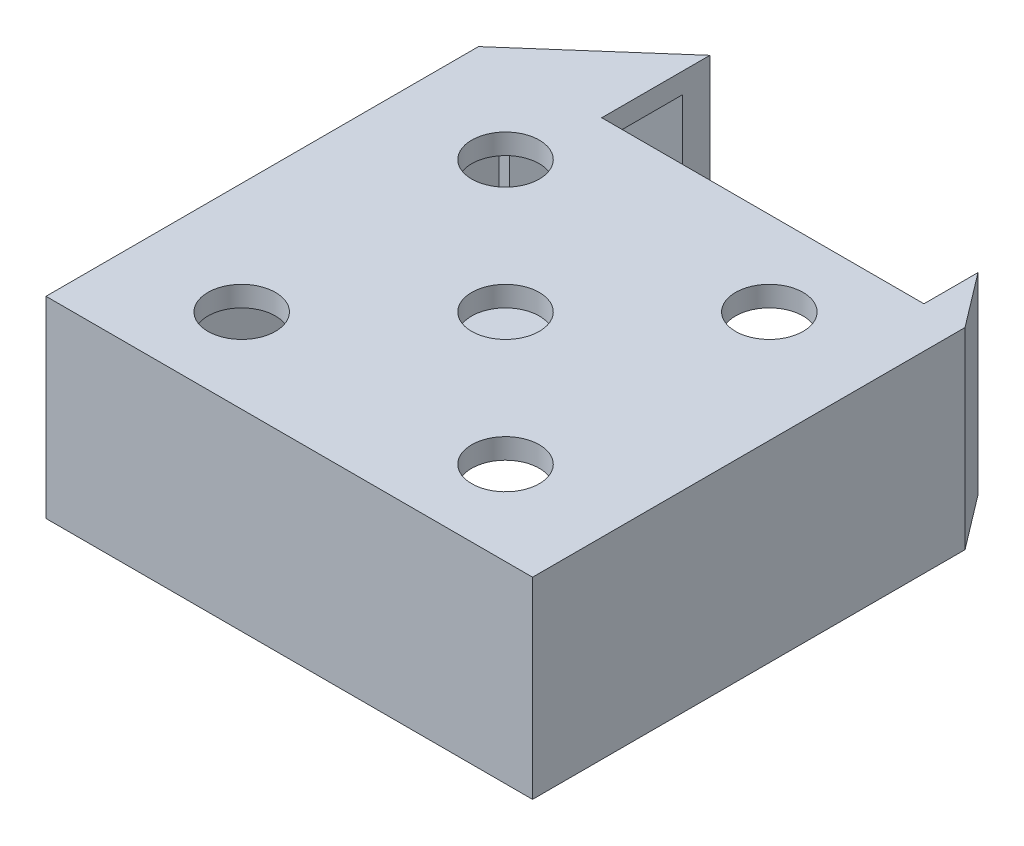
ISO-10303-21;
HEADER;
FILE_DESCRIPTION(('STEP AP214'),'2;1');
FILE_NAME('part.step','',(''),(''),'','','');
FILE_SCHEMA(('AUTOMOTIVE_DESIGN { 1 0 10303 214 1 1 1 1 }'));
ENDSEC;
DATA;
#1=APPLICATION_CONTEXT('core data for automotive mechanical design processes');
#2=APPLICATION_PROTOCOL_DEFINITION('international standard','automotive_design',2000,#1);
#3=PRODUCT_CONTEXT('',#1,'mechanical');
#4=PRODUCT('Part','Part','',(#3));
#5=PRODUCT_RELATED_PRODUCT_CATEGORY('part','',(#4));
#6=PRODUCT_DEFINITION_FORMATION('','',#4);
#7=PRODUCT_DEFINITION_CONTEXT('part definition',#1,'design');
#8=PRODUCT_DEFINITION('design','',#6,#7);
#9=PRODUCT_DEFINITION_SHAPE('','',#8);
#10=(LENGTH_UNIT() NAMED_UNIT(*) SI_UNIT(.MILLI.,.METRE.));
#11=(NAMED_UNIT(*) PLANE_ANGLE_UNIT() SI_UNIT($,.RADIAN.));
#12=(NAMED_UNIT(*) SI_UNIT($,.STERADIAN.) SOLID_ANGLE_UNIT());
#13=UNCERTAINTY_MEASURE_WITH_UNIT(LENGTH_MEASURE(1.E-05),#10,'distance_accuracy_value','');
#14=(GEOMETRIC_REPRESENTATION_CONTEXT(3) GLOBAL_UNCERTAINTY_ASSIGNED_CONTEXT((#13)) GLOBAL_UNIT_ASSIGNED_CONTEXT((#10,
#11,#12)) REPRESENTATION_CONTEXT('',''));
#15=CARTESIAN_POINT('',(0.,0.,0.));
#16=DIRECTION('',(0.,0.,1.));
#17=DIRECTION('',(1.,0.,0.));
#18=AXIS2_PLACEMENT_3D('',#15,#16,#17);
#19=CARTESIAN_POINT('',(23.749,-30.5618287286636,-31.75));
#20=DIRECTION('',(-1.,0.,0.));
#21=DIRECTION('',(0.,0.,1.));
#22=AXIS2_PLACEMENT_3D('',#19,#20,#21);
#23=PLANE('',#22);
#24=DIRECTION('',(0.,1.,0.));
#25=VECTOR('',#24,1.);
#26=CARTESIAN_POINT('',(23.749,-30.5618287286636,-25.4));
#27=LINE('',#26,#25);
#28=CARTESIAN_POINT('',(23.749,-11.303,-25.4));
#29=VERTEX_POINT('',#28);
#30=CARTESIAN_POINT('',(23.749,-8.903000228,-25.4));
#31=VERTEX_POINT('',#30);
#32=EDGE_CURVE('E189',#29,#31,#27,.T.);
#33=ORIENTED_EDGE('',*,*,#32,.T.);
#34=DIRECTION('',(0.,0.,-1.));
#35=VECTOR('',#34,1.);
#36=CARTESIAN_POINT('',(23.749,-8.903000228,-31.75));
#37=LINE('',#36,#35);
#38=CARTESIAN_POINT('',(23.749,-8.903000228,-27.7836041322331));
#39=VERTEX_POINT('',#38);
#40=EDGE_CURVE('E173',#31,#39,#37,.T.);
#41=ORIENTED_EDGE('',*,*,#40,.T.);
#42=DIRECTION('',(0.,1.,0.));
#43=VECTOR('',#42,1.);
#44=CARTESIAN_POINT('',(23.749,-30.5618287286636,-27.7836041322331));
#45=LINE('',#44,#43);
#46=CARTESIAN_POINT('',(23.749,8.903000228,-27.7836041322331));
#47=VERTEX_POINT('',#46);
#48=EDGE_CURVE('E180',#39,#47,#45,.T.);
#49=ORIENTED_EDGE('',*,*,#48,.T.);
#50=DIRECTION('',(0.,0.,1.));
#51=VECTOR('',#50,1.);
#52=CARTESIAN_POINT('',(23.749,8.903000228,0.));
#53=LINE('',#52,#51);
#54=CARTESIAN_POINT('',(23.749,8.903000228,-25.4));
#55=VERTEX_POINT('',#54);
#56=EDGE_CURVE('E59',#47,#55,#53,.T.);
#57=ORIENTED_EDGE('',*,*,#56,.T.);
#58=CARTESIAN_POINT('',(23.749,11.303,-25.4));
#59=VERTEX_POINT('',#58);
#60=EDGE_CURVE('E231',#55,#59,#27,.T.);
#61=ORIENTED_EDGE('',*,*,#60,.T.);
#62=DIRECTION('',(0.,0.,1.));
#63=VECTOR('',#62,1.);
#64=CARTESIAN_POINT('',(23.749,11.303,-31.75));
#65=LINE('',#64,#63);
#66=CARTESIAN_POINT('',(23.749,11.303,-31.75));
#67=VERTEX_POINT('',#66);
#68=EDGE_CURVE('E224',#67,#59,#65,.T.);
#69=ORIENTED_EDGE('',*,*,#68,.F.);
#70=DIRECTION('',(0.,1.,0.));
#71=VECTOR('',#70,1.);
#72=CARTESIAN_POINT('',(23.749,-30.5618287286636,-31.75));
#73=LINE('',#72,#71);
#74=CARTESIAN_POINT('',(23.749,-11.303,-31.75));
#75=VERTEX_POINT('',#74);
#76=EDGE_CURVE('E228',#75,#67,#73,.T.);
#77=ORIENTED_EDGE('',*,*,#76,.F.);
#78=DIRECTION('',(0.,0.,-1.));
#79=VECTOR('',#78,1.);
#80=CARTESIAN_POINT('',(23.749,-11.303,-31.75));
#81=LINE('',#80,#79);
#82=EDGE_CURVE('E220',#29,#75,#81,.T.);
#83=ORIENTED_EDGE('',*,*,#82,.F.);
#84=EDGE_LOOP('',(#33,#41,#49,#57,#61,#69,#77,#83));
#85=FACE_BOUND('',#84,.T.);
#86=ADVANCED_FACE('F41',(#85),#23,.T.);
#87=CARTESIAN_POINT('',(-14.097,-30.5618287286636,-25.4));
#88=DIRECTION('',(1.,0.,0.));
#89=DIRECTION('',(0.,0.,-1.));
#90=AXIS2_PLACEMENT_3D('',#87,#88,#89);
#91=PLANE('',#90);
#92=DIRECTION('',(0.,1.,0.));
#93=VECTOR('',#92,1.);
#94=CARTESIAN_POINT('',(-14.097,-30.5618287286636,-34.907488288591));
#95=LINE('',#94,#93);
#96=CARTESIAN_POINT('',(-14.097,-8.903000228,-34.907488288591));
#97=VERTEX_POINT('',#96);
#98=CARTESIAN_POINT('',(-14.097,8.903000228,-34.907488288591));
#99=VERTEX_POINT('',#98);
#100=EDGE_CURVE('E208',#97,#99,#95,.T.);
#101=ORIENTED_EDGE('',*,*,#100,.F.);
#102=DIRECTION('',(0.,0.,1.));
#103=VECTOR('',#102,1.);
#104=CARTESIAN_POINT('',(-14.097,-8.903000228,-25.4));
#105=LINE('',#104,#103);
#106=CARTESIAN_POINT('',(-14.097,-8.903000228,-25.4));
#107=VERTEX_POINT('',#106);
#108=EDGE_CURVE('E205',#97,#107,#105,.T.);
#109=ORIENTED_EDGE('',*,*,#108,.T.);
#110=DIRECTION('',(0.,1.,0.));
#111=VECTOR('',#110,1.);
#112=CARTESIAN_POINT('',(-14.097,-30.5618287286636,-25.4));
#113=LINE('',#112,#111);
#114=CARTESIAN_POINT('',(-14.097,-11.303,-25.4));
#115=VERTEX_POINT('',#114);
#116=EDGE_CURVE('E52',#115,#107,#113,.T.);
#117=ORIENTED_EDGE('',*,*,#116,.F.);
#118=DIRECTION('',(0.,0.,1.));
#119=VECTOR('',#118,1.);
#120=CARTESIAN_POINT('',(-14.097,-11.303,-25.4));
#121=LINE('',#120,#119);
#122=CARTESIAN_POINT('',(-14.097,-11.303,-38.1));
#123=VERTEX_POINT('',#122);
#124=EDGE_CURVE('E240',#123,#115,#121,.T.);
#125=ORIENTED_EDGE('',*,*,#124,.F.);
#126=DIRECTION('',(0.,1.,0.));
#127=VECTOR('',#126,1.);
#128=CARTESIAN_POINT('',(-14.097,-30.5618287286636,-38.1));
#129=LINE('',#128,#127);
#130=CARTESIAN_POINT('',(-14.097,11.303,-38.1));
#131=VERTEX_POINT('',#130);
#132=EDGE_CURVE('E245',#123,#131,#129,.T.);
#133=ORIENTED_EDGE('',*,*,#132,.T.);
#134=DIRECTION('',(0.,0.,-1.));
#135=VECTOR('',#134,1.);
#136=CARTESIAN_POINT('',(-14.097,11.303,-25.4));
#137=LINE('',#136,#135);
#138=CARTESIAN_POINT('',(-14.097,11.303,-25.4));
#139=VERTEX_POINT('',#138);
#140=EDGE_CURVE('E252',#139,#131,#137,.T.);
#141=ORIENTED_EDGE('',*,*,#140,.F.);
#142=CARTESIAN_POINT('',(-14.097,8.903000228,-25.4));
#143=VERTEX_POINT('',#142);
#144=EDGE_CURVE('E12',#143,#139,#113,.T.);
#145=ORIENTED_EDGE('',*,*,#144,.F.);
#146=DIRECTION('',(0.,0.,-1.));
#147=VECTOR('',#146,1.);
#148=CARTESIAN_POINT('',(-14.097,8.903000228,0.));
#149=LINE('',#148,#147);
#150=EDGE_CURVE('E200',#143,#99,#149,.T.);
#151=ORIENTED_EDGE('',*,*,#150,.T.);
#152=EDGE_LOOP('',(#101,#109,#117,#125,#133,#141,#145,#151));
#153=FACE_BOUND('',#152,.T.);
#154=ADVANCED_FACE('F451',(#153),#91,.T.);
#155=CARTESIAN_POINT('',(-28.575,11.303,-25.4));
#156=DIRECTION('',(0.,0.,1.));
#157=DIRECTION('',(1.,0.,0.));
#158=AXIS2_PLACEMENT_3D('',#155,#156,#157);
#159=PLANE('',#158);
#160=DIRECTION('',(-1.,0.,0.));
#161=VECTOR('',#160,1.);
#162=CARTESIAN_POINT('',(-28.575,11.303,-25.4));
#163=LINE('',#162,#161);
#164=EDGE_CURVE('E395',#59,#139,#163,.T.);
#165=ORIENTED_EDGE('',*,*,#164,.F.);
#166=ORIENTED_EDGE('',*,*,#60,.F.);
#167=DIRECTION('',(1.,0.,0.));
#168=VECTOR('',#167,1.);
#169=CARTESIAN_POINT('',(26.175000228,8.903000228,-25.4));
#170=LINE('',#169,#168);
#171=EDGE_CURVE('E362',#143,#55,#170,.T.);
#172=ORIENTED_EDGE('',*,*,#171,.F.);
#173=ORIENTED_EDGE('',*,*,#144,.T.);
#174=EDGE_LOOP('',(#165,#166,#172,#173));
#175=FACE_BOUND('',#174,.T.);
#176=ADVANCED_FACE('F492',(#175),#159,.F.);
#177=CARTESIAN_POINT('',(-28.575,11.303,-25.4));
#178=DIRECTION('',(1.,0.,0.));
#179=DIRECTION('',(0.,0.,-1.));
#180=AXIS2_PLACEMENT_3D('',#177,#178,#179);
#181=PLANE('',#180);
#182=DIRECTION('',(0.,0.,1.));
#183=VECTOR('',#182,1.);
#184=CARTESIAN_POINT('',(-28.575,-11.303,-25.4));
#185=LINE('',#184,#183);
#186=CARTESIAN_POINT('',(-28.575,-11.303,-25.4));
#187=VERTEX_POINT('',#186);
#188=CARTESIAN_POINT('',(-28.575,-11.303,25.4));
#189=VERTEX_POINT('',#188);
#190=EDGE_CURVE('E382',#187,#189,#185,.T.);
#191=ORIENTED_EDGE('',*,*,#190,.T.);
#192=DIRECTION('',(0.,-1.,0.));
#193=VECTOR('',#192,1.);
#194=CARTESIAN_POINT('',(-28.575,11.303,25.4));
#195=LINE('',#194,#193);
#196=CARTESIAN_POINT('',(-28.575,11.303,25.4));
#197=VERTEX_POINT('',#196);
#198=EDGE_CURVE('E45',#197,#189,#195,.T.);
#199=ORIENTED_EDGE('',*,*,#198,.F.);
#200=DIRECTION('',(0.,0.,1.));
#201=VECTOR('',#200,1.);
#202=CARTESIAN_POINT('',(-28.575,11.303,-25.4));
#203=LINE('',#202,#201);
#204=CARTESIAN_POINT('',(-28.575,11.303,-25.4));
#205=VERTEX_POINT('',#204);
#206=EDGE_CURVE('E383',#205,#197,#203,.T.);
#207=ORIENTED_EDGE('',*,*,#206,.F.);
#208=DIRECTION('',(0.,-1.,0.));
#209=VECTOR('',#208,1.);
#210=CARTESIAN_POINT('',(-28.575,11.303,-25.4));
#211=LINE('',#210,#209);
#212=EDGE_CURVE('E398',#205,#187,#211,.T.);
#213=ORIENTED_EDGE('',*,*,#212,.T.);
#214=EDGE_LOOP('',(#191,#199,#207,#213));
#215=FACE_BOUND('',#214,.T.);
#216=ADVANCED_FACE('F43',(#215),#181,.F.);
#217=CARTESIAN_POINT('',(-28.575,11.303,25.4));
#218=DIRECTION('',(0.,0.,-1.));
#219=DIRECTION('',(-1.,0.,0.));
#220=AXIS2_PLACEMENT_3D('',#217,#218,#219);
#221=PLANE('',#220);
#222=DIRECTION('',(1.,0.,0.));
#223=VECTOR('',#222,1.);
#224=CARTESIAN_POINT('',(-28.575,-11.303,25.4));
#225=LINE('',#224,#223);
#226=CARTESIAN_POINT('',(28.575,-11.303,25.4));
#227=VERTEX_POINT('',#226);
#228=EDGE_CURVE('E402',#189,#227,#225,.T.);
#229=ORIENTED_EDGE('',*,*,#228,.T.);
#230=DIRECTION('',(0.,-1.,0.));
#231=VECTOR('',#230,1.);
#232=CARTESIAN_POINT('',(28.575,11.303,25.4));
#233=LINE('',#232,#231);
#234=CARTESIAN_POINT('',(28.575,11.303,25.4));
#235=VERTEX_POINT('',#234);
#236=EDGE_CURVE('E417',#235,#227,#233,.T.);
#237=ORIENTED_EDGE('',*,*,#236,.F.);
#238=DIRECTION('',(1.,0.,0.));
#239=VECTOR('',#238,1.);
#240=CARTESIAN_POINT('',(-28.575,11.303,25.4));
#241=LINE('',#240,#239);
#242=EDGE_CURVE('E387',#197,#235,#241,.T.);
#243=ORIENTED_EDGE('',*,*,#242,.F.);
#244=ORIENTED_EDGE('',*,*,#198,.T.);
#245=EDGE_LOOP('',(#229,#237,#243,#244));
#246=FACE_BOUND('',#245,.T.);
#247=ADVANCED_FACE('F428',(#246),#221,.F.);
#248=CARTESIAN_POINT('',(28.575,11.303,-25.4));
#249=DIRECTION('',(-1.,0.,0.));
#250=DIRECTION('',(0.,0.,1.));
#251=AXIS2_PLACEMENT_3D('',#248,#249,#250);
#252=PLANE('',#251);
#253=DIRECTION('',(0.,0.,-1.));
#254=VECTOR('',#253,1.);
#255=CARTESIAN_POINT('',(28.575,-11.303,-25.4));
#256=LINE('',#255,#254);
#257=CARTESIAN_POINT('',(28.575,-11.303,-25.4));
#258=VERTEX_POINT('',#257);
#259=EDGE_CURVE('E405',#227,#258,#256,.T.);
#260=ORIENTED_EDGE('',*,*,#259,.T.);
#261=DIRECTION('',(0.,-1.,0.));
#262=VECTOR('',#261,1.);
#263=CARTESIAN_POINT('',(28.575,11.303,-25.4));
#264=LINE('',#263,#262);
#265=CARTESIAN_POINT('',(28.575,11.303,-25.4));
#266=VERTEX_POINT('',#265);
#267=EDGE_CURVE('E414',#266,#258,#264,.T.);
#268=ORIENTED_EDGE('',*,*,#267,.F.);
#269=DIRECTION('',(0.,0.,-1.));
#270=VECTOR('',#269,1.);
#271=CARTESIAN_POINT('',(28.575,11.303,-25.4));
#272=LINE('',#271,#270);
#273=EDGE_CURVE('E391',#235,#266,#272,.T.);
#274=ORIENTED_EDGE('',*,*,#273,.F.);
#275=ORIENTED_EDGE('',*,*,#236,.T.);
#276=EDGE_LOOP('',(#260,#268,#274,#275));
#277=FACE_BOUND('',#276,.T.);
#278=ADVANCED_FACE('F437',(#277),#252,.F.);
#279=DIRECTION('',(-1.,0.,0.));
#280=VECTOR('',#279,1.);
#281=CARTESIAN_POINT('',(26.175000228,-8.903000228,-25.4));
#282=LINE('',#281,#280);
#283=EDGE_CURVE('E358',#31,#107,#282,.T.);
#284=ORIENTED_EDGE('',*,*,#283,.F.);
#285=ORIENTED_EDGE('',*,*,#32,.F.);
#286=DIRECTION('',(-1.,0.,0.));
#287=VECTOR('',#286,1.);
#288=CARTESIAN_POINT('',(-28.575,-11.303,-25.4));
#289=LINE('',#288,#287);
#290=EDGE_CURVE('E388',#29,#115,#289,.T.);
#291=ORIENTED_EDGE('',*,*,#290,.T.);
#292=ORIENTED_EDGE('',*,*,#116,.T.);
#293=EDGE_LOOP('',(#284,#285,#291,#292));
#294=FACE_BOUND('',#293,.T.);
#295=ADVANCED_FACE('F456',(#294),#159,.F.);
#296=CARTESIAN_POINT('',(0.,11.303,0.));
#297=DIRECTION('',(0.,1.,0.));
#298=DIRECTION('',(0.,0.,1.));
#299=AXIS2_PLACEMENT_3D('',#296,#297,#298);
#300=PLANE('',#299);
#301=CARTESIAN_POINT('',(0.,11.303,0.));
#302=DIRECTION('',(0.,1.,0.));
#303=DIRECTION('',(0.,0.,1.));
#304=AXIS2_PLACEMENT_3D('',#301,#302,#303);
#305=CIRCLE('',#304,3.96875);
#306=CARTESIAN_POINT('',(0.,11.303,3.96875));
#307=VERTEX_POINT('',#306);
#308=EDGE_CURVE('E248',#307,#307,#305,.T.);
#309=ORIENTED_EDGE('',*,*,#308,.F.);
#310=EDGE_LOOP('',(#309));
#311=FACE_BOUND('',#310,.T.);
#312=CARTESIAN_POINT('',(-15.494,11.303,15.494));
#313=DIRECTION('',(0.,1.,0.));
#314=DIRECTION('',(0.,0.,1.));
#315=AXIS2_PLACEMENT_3D('',#312,#313,#314);
#316=CIRCLE('',#315,3.96875);
#317=CARTESIAN_POINT('',(-15.494,11.303,19.46275));
#318=VERTEX_POINT('',#317);
#319=EDGE_CURVE('E278',#318,#318,#316,.T.);
#320=ORIENTED_EDGE('',*,*,#319,.F.);
#321=EDGE_LOOP('',(#320));
#322=FACE_BOUND('',#321,.T.);
#323=CARTESIAN_POINT('',(15.494,11.303,15.494));
#324=DIRECTION('',(0.,1.,0.));
#325=DIRECTION('',(0.,0.,1.));
#326=AXIS2_PLACEMENT_3D('',#323,#324,#325);
#327=CIRCLE('',#326,3.96875);
#328=CARTESIAN_POINT('',(15.494,11.303,19.46275));
#329=VERTEX_POINT('',#328);
#330=EDGE_CURVE('E270',#329,#329,#327,.T.);
#331=ORIENTED_EDGE('',*,*,#330,.F.);
#332=EDGE_LOOP('',(#331));
#333=FACE_BOUND('',#332,.T.);
#334=CARTESIAN_POINT('',(15.494,11.303,-15.494));
#335=DIRECTION('',(0.,1.,0.));
#336=DIRECTION('',(0.,0.,1.));
#337=AXIS2_PLACEMENT_3D('',#334,#335,#336);
#338=CIRCLE('',#337,3.96875);
#339=CARTESIAN_POINT('',(15.494,11.303,-11.52525));
#340=VERTEX_POINT('',#339);
#341=EDGE_CURVE('E260',#340,#340,#338,.T.);
#342=ORIENTED_EDGE('',*,*,#341,.F.);
#343=EDGE_LOOP('',(#342));
#344=FACE_BOUND('',#343,.T.);
#345=CARTESIAN_POINT('',(-15.494,11.303,-15.494));
#346=DIRECTION('',(0.,1.,0.));
#347=DIRECTION('',(0.,0.,1.));
#348=AXIS2_PLACEMENT_3D('',#345,#346,#347);
#349=CIRCLE('',#348,3.96875);
#350=CARTESIAN_POINT('',(-15.494,11.303,-11.52525));
#351=VERTEX_POINT('',#350);
#352=EDGE_CURVE('E269',#351,#351,#349,.T.);
#353=ORIENTED_EDGE('',*,*,#352,.F.);
#354=EDGE_LOOP('',(#353));
#355=FACE_BOUND('',#354,.T.);
#356=ORIENTED_EDGE('',*,*,#206,.T.);
#357=ORIENTED_EDGE('',*,*,#242,.T.);
#358=ORIENTED_EDGE('',*,*,#273,.T.);
#359=DIRECTION('',(-0.605083267533558,0.,-0.796162194123103));
#360=VECTOR('',#359,1.);
#361=CARTESIAN_POINT('',(28.575,11.303,-25.4));
#362=LINE('',#361,#360);
#363=EDGE_CURVE('E216',#266,#67,#362,.T.);
#364=ORIENTED_EDGE('',*,*,#363,.T.);
#365=ORIENTED_EDGE('',*,*,#68,.T.);
#366=ORIENTED_EDGE('',*,*,#164,.T.);
#367=ORIENTED_EDGE('',*,*,#140,.T.);
#368=DIRECTION('',(-0.751759112871275,0.,0.659437818308136));
#369=VECTOR('',#368,1.);
#370=CARTESIAN_POINT('',(-14.097,11.303,-38.1));
#371=LINE('',#370,#369);
#372=EDGE_CURVE('E239',#131,#205,#371,.T.);
#373=ORIENTED_EDGE('',*,*,#372,.T.);
#374=EDGE_LOOP('',(#356,#357,#358,#364,#365,#366,#367,#373));
#375=FACE_BOUND('',#374,.T.);
#376=ADVANCED_FACE('F443',(#311,#322,#333,#344,#355,#375),#300,.T.);
#377=CARTESIAN_POINT('',(0.,-11.303,0.));
#378=DIRECTION('',(0.,1.,0.));
#379=DIRECTION('',(0.,0.,1.));
#380=AXIS2_PLACEMENT_3D('',#377,#378,#379);
#381=PLANE('',#380);
#382=CARTESIAN_POINT('',(0.,-11.303,0.));
#383=DIRECTION('',(0.,-1.,0.));
#384=DIRECTION('',(0.,0.,-1.));
#385=AXIS2_PLACEMENT_3D('',#382,#383,#384);
#386=CIRCLE('',#385,11.1125);
#387=CARTESIAN_POINT('',(0.,-11.303,-11.1125));
#388=VERTEX_POINT('',#387);
#389=EDGE_CURVE('E299',#388,#388,#386,.T.);
#390=ORIENTED_EDGE('',*,*,#389,.F.);
#391=EDGE_LOOP('',(#390));
#392=FACE_BOUND('',#391,.T.);
#393=CARTESIAN_POINT('',(-15.494,-11.303,-15.494));
#394=DIRECTION('',(0.,-1.,0.));
#395=DIRECTION('',(0.,0.,-1.));
#396=AXIS2_PLACEMENT_3D('',#393,#394,#395);
#397=CIRCLE('',#396,2.032);
#398=CARTESIAN_POINT('',(-15.494,-11.303,-17.526));
#399=VERTEX_POINT('',#398);
#400=EDGE_CURVE('E318',#399,#399,#397,.T.);
#401=ORIENTED_EDGE('',*,*,#400,.F.);
#402=EDGE_LOOP('',(#401));
#403=FACE_BOUND('',#402,.T.);
#404=CARTESIAN_POINT('',(15.494,-11.303,-15.494));
#405=DIRECTION('',(0.,-1.,0.));
#406=DIRECTION('',(0.,0.,-1.));
#407=AXIS2_PLACEMENT_3D('',#404,#405,#406);
#408=CIRCLE('',#407,2.032);
#409=CARTESIAN_POINT('',(15.494,-11.303,-17.526));
#410=VERTEX_POINT('',#409);
#411=EDGE_CURVE('E310',#410,#410,#408,.T.);
#412=ORIENTED_EDGE('',*,*,#411,.F.);
#413=EDGE_LOOP('',(#412));
#414=FACE_BOUND('',#413,.T.);
#415=CARTESIAN_POINT('',(15.494,-11.303,15.494));
#416=DIRECTION('',(0.,-1.,0.));
#417=DIRECTION('',(0.,0.,-1.));
#418=AXIS2_PLACEMENT_3D('',#415,#416,#417);
#419=CIRCLE('',#418,2.032);
#420=CARTESIAN_POINT('',(15.494,-11.303,13.462));
#421=VERTEX_POINT('',#420);
#422=EDGE_CURVE('E300',#421,#421,#419,.T.);
#423=ORIENTED_EDGE('',*,*,#422,.F.);
#424=EDGE_LOOP('',(#423));
#425=FACE_BOUND('',#424,.T.);
#426=CARTESIAN_POINT('',(-15.494,-11.303,15.494));
#427=DIRECTION('',(0.,-1.,0.));
#428=DIRECTION('',(0.,0.,-1.));
#429=AXIS2_PLACEMENT_3D('',#426,#427,#428);
#430=CIRCLE('',#429,2.032);
#431=CARTESIAN_POINT('',(-15.494,-11.303,13.462));
#432=VERTEX_POINT('',#431);
#433=EDGE_CURVE('E309',#432,#432,#430,.T.);
#434=ORIENTED_EDGE('',*,*,#433,.F.);
#435=EDGE_LOOP('',(#434));
#436=FACE_BOUND('',#435,.T.);
#437=ORIENTED_EDGE('',*,*,#190,.F.);
#438=DIRECTION('',(0.751759112871275,0.,-0.659437818308136));
#439=VECTOR('',#438,1.);
#440=CARTESIAN_POINT('',(-14.097,-11.303,-38.1));
#441=LINE('',#440,#439);
#442=EDGE_CURVE('E244',#187,#123,#441,.T.);
#443=ORIENTED_EDGE('',*,*,#442,.T.);
#444=ORIENTED_EDGE('',*,*,#124,.T.);
#445=ORIENTED_EDGE('',*,*,#290,.F.);
#446=ORIENTED_EDGE('',*,*,#82,.T.);
#447=DIRECTION('',(0.605083267533558,0.,0.796162194123103));
#448=VECTOR('',#447,1.);
#449=CARTESIAN_POINT('',(28.575,-11.303,-25.4));
#450=LINE('',#449,#448);
#451=EDGE_CURVE('E217',#75,#258,#450,.T.);
#452=ORIENTED_EDGE('',*,*,#451,.T.);
#453=ORIENTED_EDGE('',*,*,#259,.F.);
#454=ORIENTED_EDGE('',*,*,#228,.F.);
#455=EDGE_LOOP('',(#437,#443,#444,#445,#446,#452,#453,#454));
#456=FACE_BOUND('',#455,.T.);
#457=ADVANCED_FACE('F433',(#392,#403,#414,#425,#436,#456),#381,.F.);
#458=CARTESIAN_POINT('',(26.175000228,8.903000228,80.6953542350736));
#459=DIRECTION('',(1.,0.,0.));
#460=DIRECTION('',(0.,0.,-1.));
#461=AXIS2_PLACEMENT_3D('',#458,#459,#460);
#462=PLANE('',#461);
#463=DIRECTION('',(0.,1.,0.));
#464=VECTOR('',#463,1.);
#465=CARTESIAN_POINT('',(26.175000228,8.903000228,23.114));
#466=LINE('',#465,#464);
#467=CARTESIAN_POINT('',(26.175000228,-8.903000228,23.114));
#468=VERTEX_POINT('',#467);
#469=CARTESIAN_POINT('',(26.175000228,8.903000228,23.114));
#470=VERTEX_POINT('',#469);
#471=EDGE_CURVE('E347',#468,#470,#466,.T.);
#472=ORIENTED_EDGE('',*,*,#471,.T.);
#473=DIRECTION('',(0.,0.,-1.));
#474=VECTOR('',#473,1.);
#475=CARTESIAN_POINT('',(26.175000228,8.903000228,80.6953542350736));
#476=LINE('',#475,#474);
#477=CARTESIAN_POINT('',(26.175000228,8.903000228,-25.4));
#478=VERTEX_POINT('',#477);
#479=EDGE_CURVE('E344',#470,#478,#476,.T.);
#480=ORIENTED_EDGE('',*,*,#479,.T.);
#481=DIRECTION('',(0.,-1.,0.));
#482=VECTOR('',#481,1.);
#483=CARTESIAN_POINT('',(26.175000228,8.903000228,-25.4));
#484=LINE('',#483,#482);
#485=CARTESIAN_POINT('',(26.175000228,-8.903000228,-25.4));
#486=VERTEX_POINT('',#485);
#487=EDGE_CURVE('E339',#478,#486,#484,.T.);
#488=ORIENTED_EDGE('',*,*,#487,.T.);
#489=DIRECTION('',(0.,0.,-1.));
#490=VECTOR('',#489,1.);
#491=CARTESIAN_POINT('',(26.175000228,-8.903000228,80.6953542350736));
#492=LINE('',#491,#490);
#493=EDGE_CURVE('E366',#468,#486,#492,.T.);
#494=ORIENTED_EDGE('',*,*,#493,.F.);
#495=EDGE_LOOP('',(#472,#480,#488,#494));
#496=FACE_BOUND('',#495,.T.);
#497=ADVANCED_FACE('F479',(#496),#462,.F.);
#498=CARTESIAN_POINT('',(26.175000228,8.903000228,80.6953542350736));
#499=DIRECTION('',(0.,1.,0.));
#500=DIRECTION('',(0.,0.,1.));
#501=AXIS2_PLACEMENT_3D('',#498,#499,#500);
#502=PLANE('',#501);
#503=CARTESIAN_POINT('',(0.,8.903000228,0.));
#504=DIRECTION('',(0.,1.,0.));
#505=DIRECTION('',(0.,0.,1.));
#506=AXIS2_PLACEMENT_3D('',#503,#504,#505);
#507=CIRCLE('',#506,3.96875);
#508=CARTESIAN_POINT('',(0.,8.903000228,3.96875));
#509=VERTEX_POINT('',#508);
#510=EDGE_CURVE('E282',#509,#509,#507,.F.);
#511=ORIENTED_EDGE('',*,*,#510,.F.);
#512=EDGE_LOOP('',(#511));
#513=FACE_BOUND('',#512,.T.);
#514=CARTESIAN_POINT('',(-15.494,8.903000228,15.494));
#515=DIRECTION('',(0.,1.,0.));
#516=DIRECTION('',(0.,0.,1.));
#517=AXIS2_PLACEMENT_3D('',#514,#515,#516);
#518=CIRCLE('',#517,3.96875);
#519=CARTESIAN_POINT('',(-15.494,8.903000228,19.46275));
#520=VERTEX_POINT('',#519);
#521=EDGE_CURVE('E274',#520,#520,#518,.F.);
#522=ORIENTED_EDGE('',*,*,#521,.F.);
#523=EDGE_LOOP('',(#522));
#524=FACE_BOUND('',#523,.T.);
#525=CARTESIAN_POINT('',(15.494,8.903000228,15.494));
#526=DIRECTION('',(0.,1.,0.));
#527=DIRECTION('',(0.,0.,1.));
#528=AXIS2_PLACEMENT_3D('',#525,#526,#527);
#529=CIRCLE('',#528,3.96875);
#530=CARTESIAN_POINT('',(15.494,8.903000228,19.46275));
#531=VERTEX_POINT('',#530);
#532=EDGE_CURVE('E265',#531,#531,#529,.F.);
#533=ORIENTED_EDGE('',*,*,#532,.F.);
#534=EDGE_LOOP('',(#533));
#535=FACE_BOUND('',#534,.T.);
#536=CARTESIAN_POINT('',(15.494,8.903000228,-15.494));
#537=DIRECTION('',(0.,1.,0.));
#538=DIRECTION('',(0.,0.,1.));
#539=AXIS2_PLACEMENT_3D('',#536,#537,#538);
#540=CIRCLE('',#539,3.96875);
#541=CARTESIAN_POINT('',(15.494,8.903000228,-11.52525));
#542=VERTEX_POINT('',#541);
#543=EDGE_CURVE('E264',#542,#542,#540,.F.);
#544=ORIENTED_EDGE('',*,*,#543,.F.);
#545=EDGE_LOOP('',(#544));
#546=FACE_BOUND('',#545,.T.);
#547=CARTESIAN_POINT('',(-15.494,8.903000228,-15.494));
#548=DIRECTION('',(0.,1.,0.));
#549=DIRECTION('',(0.,0.,1.));
#550=AXIS2_PLACEMENT_3D('',#547,#548,#549);
#551=CIRCLE('',#550,3.96875);
#552=CARTESIAN_POINT('',(-15.494,8.903000228,-11.52525));
#553=VERTEX_POINT('',#552);
#554=EDGE_CURVE('E295',#553,#553,#551,.F.);
#555=ORIENTED_EDGE('',*,*,#554,.F.);
#556=EDGE_LOOP('',(#555));
#557=FACE_BOUND('',#556,.T.);
#558=DIRECTION('',(-1.,0.,0.));
#559=VECTOR('',#558,1.);
#560=CARTESIAN_POINT('',(26.175000228,8.903000228,23.114));
#561=LINE('',#560,#559);
#562=CARTESIAN_POINT('',(-26.175000228,8.903000228,23.114));
#563=VERTEX_POINT('',#562);
#564=EDGE_CURVE('E343',#470,#563,#561,.T.);
#565=ORIENTED_EDGE('',*,*,#564,.T.);
#566=DIRECTION('',(0.,0.,-1.));
#567=VECTOR('',#566,1.);
#568=CARTESIAN_POINT('',(-26.175000228,8.903000228,80.6953542350736));
#569=LINE('',#568,#567);
#570=CARTESIAN_POINT('',(-26.175000228,8.903000228,-25.4));
#571=VERTEX_POINT('',#570);
#572=EDGE_CURVE('E370',#563,#571,#569,.T.);
#573=ORIENTED_EDGE('',*,*,#572,.T.);
#574=CARTESIAN_POINT('',(-24.9355366489937,8.903000228,-25.4));
#575=VERTEX_POINT('',#574);
#576=EDGE_CURVE('E363',#571,#575,#170,.T.);
#577=ORIENTED_EDGE('',*,*,#576,.T.);
#578=DIRECTION('',(-0.751759112871275,0.,0.659437818308136));
#579=VECTOR('',#578,1.);
#580=CARTESIAN_POINT('',(-23.4351785740971,8.903000228,-26.7161035744707));
#581=LINE('',#580,#579);
#582=EDGE_CURVE('E66',#99,#575,#581,.T.);
#583=ORIENTED_EDGE('',*,*,#582,.F.);
#584=ORIENTED_EDGE('',*,*,#150,.F.);
#585=ORIENTED_EDGE('',*,*,#171,.T.);
#586=ORIENTED_EDGE('',*,*,#56,.F.);
#587=DIRECTION('',(-0.605083267533558,0.,-0.796162194123103));
#588=VECTOR('',#587,1.);
#589=CARTESIAN_POINT('',(28.4384756215119,8.903000228,-21.613241472349));
#590=LINE('',#589,#588);
#591=CARTESIAN_POINT('',(25.5605391404971,8.903000228,-25.4));
#592=VERTEX_POINT('',#591);
#593=EDGE_CURVE('E184',#592,#47,#590,.T.);
#594=ORIENTED_EDGE('',*,*,#593,.F.);
#595=DIRECTION('',(1.,0.,0.));
#596=VECTOR('',#595,1.);
#597=CARTESIAN_POINT('',(26.175000228,8.903000228,-25.4));
#598=LINE('',#597,#596);
#599=EDGE_CURVE('E236',#592,#478,#598,.T.);
#600=ORIENTED_EDGE('',*,*,#599,.T.);
#601=ORIENTED_EDGE('',*,*,#479,.F.);
#602=EDGE_LOOP('',(#565,#573,#577,#583,#584,#585,#586,#594,#600,#601));
#603=FACE_BOUND('',#602,.T.);
#604=ADVANCED_FACE('F484',(#513,#524,#535,#546,#557,#603),#502,.F.);
#605=CARTESIAN_POINT('',(-26.175000228,8.903000228,80.6953542350736));
#606=DIRECTION('',(-1.,0.,0.));
#607=DIRECTION('',(0.,0.,1.));
#608=AXIS2_PLACEMENT_3D('',#605,#606,#607);
#609=PLANE('',#608);
#610=DIRECTION('',(0.,-1.,0.));
#611=VECTOR('',#610,1.);
#612=CARTESIAN_POINT('',(-26.175000228,8.903000228,23.114));
#613=LINE('',#612,#611);
#614=CARTESIAN_POINT('',(-26.175000228,-8.903000228,23.114));
#615=VERTEX_POINT('',#614);
#616=EDGE_CURVE('E340',#563,#615,#613,.T.);
#617=ORIENTED_EDGE('',*,*,#616,.T.);
#618=DIRECTION('',(0.,0.,-1.));
#619=VECTOR('',#618,1.);
#620=CARTESIAN_POINT('',(-26.175000228,-8.903000228,80.6953542350736));
#621=LINE('',#620,#619);
#622=CARTESIAN_POINT('',(-26.175000228,-8.903000228,-25.4));
#623=VERTEX_POINT('',#622);
#624=EDGE_CURVE('E374',#615,#623,#621,.T.);
#625=ORIENTED_EDGE('',*,*,#624,.T.);
#626=DIRECTION('',(0.,1.,0.));
#627=VECTOR('',#626,1.);
#628=CARTESIAN_POINT('',(-26.175000228,8.903000228,-25.4));
#629=LINE('',#628,#627);
#630=EDGE_CURVE('E357',#623,#571,#629,.T.);
#631=ORIENTED_EDGE('',*,*,#630,.T.);
#632=ORIENTED_EDGE('',*,*,#572,.F.);
#633=EDGE_LOOP('',(#617,#625,#631,#632));
#634=FACE_BOUND('',#633,.T.);
#635=ADVANCED_FACE('F470',(#634),#609,.F.);
#636=CARTESIAN_POINT('',(26.175000228,-8.903000228,80.6953542350736));
#637=DIRECTION('',(0.,-1.,0.));
#638=DIRECTION('',(0.,0.,-1.));
#639=AXIS2_PLACEMENT_3D('',#636,#637,#638);
#640=PLANE('',#639);
#641=CARTESIAN_POINT('',(0.,-8.903000228,0.));
#642=DIRECTION('',(0.,-1.,0.));
#643=DIRECTION('',(0.,0.,-1.));
#644=AXIS2_PLACEMENT_3D('',#641,#642,#643);
#645=CIRCLE('',#644,11.1125);
#646=CARTESIAN_POINT('',(0.,-8.903000228,-11.1125));
#647=VERTEX_POINT('',#646);
#648=EDGE_CURVE('E322',#647,#647,#645,.F.);
#649=ORIENTED_EDGE('',*,*,#648,.F.);
#650=EDGE_LOOP('',(#649));
#651=FACE_BOUND('',#650,.T.);
#652=CARTESIAN_POINT('',(-15.494,-8.903000228,-15.494));
#653=DIRECTION('',(0.,-1.,0.));
#654=DIRECTION('',(0.,0.,-1.));
#655=AXIS2_PLACEMENT_3D('',#652,#653,#654);
#656=CIRCLE('',#655,2.032);
#657=CARTESIAN_POINT('',(-15.494,-8.903000228,-17.526));
#658=VERTEX_POINT('',#657);
#659=EDGE_CURVE('E314',#658,#658,#656,.F.);
#660=ORIENTED_EDGE('',*,*,#659,.F.);
#661=EDGE_LOOP('',(#660));
#662=FACE_BOUND('',#661,.T.);
#663=CARTESIAN_POINT('',(15.494,-8.903000228,-15.494));
#664=DIRECTION('',(0.,-1.,0.));
#665=DIRECTION('',(0.,0.,-1.));
#666=AXIS2_PLACEMENT_3D('',#663,#664,#665);
#667=CIRCLE('',#666,2.032);
#668=CARTESIAN_POINT('',(15.494,-8.903000228,-17.526));
#669=VERTEX_POINT('',#668);
#670=EDGE_CURVE('E305',#669,#669,#667,.F.);
#671=ORIENTED_EDGE('',*,*,#670,.F.);
#672=EDGE_LOOP('',(#671));
#673=FACE_BOUND('',#672,.T.);
#674=CARTESIAN_POINT('',(15.494,-8.903000228,15.494));
#675=DIRECTION('',(0.,-1.,0.));
#676=DIRECTION('',(0.,0.,-1.));
#677=AXIS2_PLACEMENT_3D('',#674,#675,#676);
#678=CIRCLE('',#677,2.032);
#679=CARTESIAN_POINT('',(15.494,-8.903000228,13.462));
#680=VERTEX_POINT('',#679);
#681=EDGE_CURVE('E304',#680,#680,#678,.F.);
#682=ORIENTED_EDGE('',*,*,#681,.F.);
#683=EDGE_LOOP('',(#682));
#684=FACE_BOUND('',#683,.T.);
#685=CARTESIAN_POINT('',(-15.494,-8.903000228,15.494));
#686=DIRECTION('',(0.,-1.,0.));
#687=DIRECTION('',(0.,0.,-1.));
#688=AXIS2_PLACEMENT_3D('',#685,#686,#687);
#689=CIRCLE('',#688,2.032);
#690=CARTESIAN_POINT('',(-15.494,-8.903000228,13.462));
#691=VERTEX_POINT('',#690);
#692=EDGE_CURVE('E335',#691,#691,#689,.F.);
#693=ORIENTED_EDGE('',*,*,#692,.F.);
#694=EDGE_LOOP('',(#693));
#695=FACE_BOUND('',#694,.T.);
#696=DIRECTION('',(1.,0.,0.));
#697=VECTOR('',#696,1.);
#698=CARTESIAN_POINT('',(26.175000228,-8.903000228,23.114));
#699=LINE('',#698,#697);
#700=EDGE_CURVE('E350',#615,#468,#699,.T.);
#701=ORIENTED_EDGE('',*,*,#700,.T.);
#702=ORIENTED_EDGE('',*,*,#493,.T.);
#703=CARTESIAN_POINT('',(25.5605391404972,-8.903000228,-25.4));
#704=VERTEX_POINT('',#703);
#705=EDGE_CURVE('E176',#486,#704,#282,.T.);
#706=ORIENTED_EDGE('',*,*,#705,.T.);
#707=DIRECTION('',(0.605083267533558,0.,0.796162194123103));
#708=VECTOR('',#707,1.);
#709=CARTESIAN_POINT('',(26.6642109156295,-8.903000228,-23.9478002958784));
#710=LINE('',#709,#708);
#711=EDGE_CURVE('E168',#39,#704,#710,.T.);
#712=ORIENTED_EDGE('',*,*,#711,.F.);
#713=ORIENTED_EDGE('',*,*,#40,.F.);
#714=ORIENTED_EDGE('',*,*,#283,.T.);
#715=ORIENTED_EDGE('',*,*,#108,.F.);
#716=DIRECTION('',(0.751759112871275,0.,-0.659437818308136));
#717=VECTOR('',#716,1.);
#718=CARTESIAN_POINT('',(-12.5143493864123,-8.903000228,-36.29577830051));
#719=LINE('',#718,#717);
#720=CARTESIAN_POINT('',(-24.9355366489937,-8.903000228,-25.4));
#721=VERTEX_POINT('',#720);
#722=EDGE_CURVE('E201',#721,#97,#719,.T.);
#723=ORIENTED_EDGE('',*,*,#722,.F.);
#724=EDGE_CURVE('E354',#721,#623,#282,.T.);
#725=ORIENTED_EDGE('',*,*,#724,.T.);
#726=ORIENTED_EDGE('',*,*,#624,.F.);
#727=EDGE_LOOP('',(#701,#702,#706,#712,#713,#714,#715,#723,#725,#726));
#728=FACE_BOUND('',#727,.T.);
#729=ADVANCED_FACE('F170',(#651,#662,#673,#684,#695,#728),#640,.F.);
#730=CARTESIAN_POINT('',(-28.575,11.303,23.114));
#731=DIRECTION('',(0.,0.,-1.));
#732=DIRECTION('',(-1.,0.,0.));
#733=AXIS2_PLACEMENT_3D('',#730,#731,#732);
#734=PLANE('',#733);
#735=ORIENTED_EDGE('',*,*,#471,.F.);
#736=ORIENTED_EDGE('',*,*,#700,.F.);
#737=ORIENTED_EDGE('',*,*,#616,.F.);
#738=ORIENTED_EDGE('',*,*,#564,.F.);
#739=EDGE_LOOP('',(#735,#736,#737,#738));
#740=FACE_BOUND('',#739,.T.);
#741=ADVANCED_FACE('F475',(#740),#734,.T.);
#742=CARTESIAN_POINT('',(-15.494,22.527896195742,15.494));
#743=DIRECTION('',(0.,-1.,0.));
#744=DIRECTION('',(0.,0.,-1.));
#745=AXIS2_PLACEMENT_3D('',#742,#743,#744);
#746=CYLINDRICAL_SURFACE('',#745,2.032);
#747=ORIENTED_EDGE('',*,*,#692,.T.);
#748=EDGE_LOOP('',(#747));
#749=FACE_BOUND('',#748,.T.);
#750=ORIENTED_EDGE('',*,*,#433,.T.);
#751=EDGE_LOOP('',(#750));
#752=FACE_BOUND('',#751,.T.);
#753=ADVANCED_FACE('F542',(#749,#752),#746,.F.);
#754=CARTESIAN_POINT('',(15.494,22.527896195742,15.494));
#755=DIRECTION('',(0.,-1.,0.));
#756=DIRECTION('',(0.,0.,-1.));
#757=AXIS2_PLACEMENT_3D('',#754,#755,#756);
#758=CYLINDRICAL_SURFACE('',#757,2.032);
#759=ORIENTED_EDGE('',*,*,#681,.T.);
#760=EDGE_LOOP('',(#759));
#761=FACE_BOUND('',#760,.T.);
#762=ORIENTED_EDGE('',*,*,#422,.T.);
#763=EDGE_LOOP('',(#762));
#764=FACE_BOUND('',#763,.T.);
#765=ADVANCED_FACE('F538',(#761,#764),#758,.F.);
#766=CARTESIAN_POINT('',(15.494,22.527896195742,-15.494));
#767=DIRECTION('',(0.,-1.,0.));
#768=DIRECTION('',(0.,0.,-1.));
#769=AXIS2_PLACEMENT_3D('',#766,#767,#768);
#770=CYLINDRICAL_SURFACE('',#769,2.032);
#771=ORIENTED_EDGE('',*,*,#670,.T.);
#772=EDGE_LOOP('',(#771));
#773=FACE_BOUND('',#772,.T.);
#774=ORIENTED_EDGE('',*,*,#411,.T.);
#775=EDGE_LOOP('',(#774));
#776=FACE_BOUND('',#775,.T.);
#777=ADVANCED_FACE('F541',(#773,#776),#770,.F.);
#778=CARTESIAN_POINT('',(-15.494,22.527896195742,-15.494));
#779=DIRECTION('',(0.,-1.,0.));
#780=DIRECTION('',(0.,0.,-1.));
#781=AXIS2_PLACEMENT_3D('',#778,#779,#780);
#782=CYLINDRICAL_SURFACE('',#781,2.032);
#783=ORIENTED_EDGE('',*,*,#659,.T.);
#784=EDGE_LOOP('',(#783));
#785=FACE_BOUND('',#784,.T.);
#786=ORIENTED_EDGE('',*,*,#400,.T.);
#787=EDGE_LOOP('',(#786));
#788=FACE_BOUND('',#787,.T.);
#789=ADVANCED_FACE('F546',(#785,#788),#782,.F.);
#790=CARTESIAN_POINT('',(0.,22.527896195742,0.));
#791=DIRECTION('',(0.,-1.,0.));
#792=DIRECTION('',(0.,0.,-1.));
#793=AXIS2_PLACEMENT_3D('',#790,#791,#792);
#794=CYLINDRICAL_SURFACE('',#793,11.1125);
#795=ORIENTED_EDGE('',*,*,#648,.T.);
#796=EDGE_LOOP('',(#795));
#797=FACE_BOUND('',#796,.T.);
#798=ORIENTED_EDGE('',*,*,#389,.T.);
#799=EDGE_LOOP('',(#798));
#800=FACE_BOUND('',#799,.T.);
#801=ADVANCED_FACE('F536',(#797,#800),#794,.F.);
#802=CARTESIAN_POINT('',(-15.494,-2.32231992333645,-15.494));
#803=DIRECTION('',(0.,1.,0.));
#804=DIRECTION('',(0.,0.,1.));
#805=AXIS2_PLACEMENT_3D('',#802,#803,#804);
#806=CYLINDRICAL_SURFACE('',#805,3.96875);
#807=ORIENTED_EDGE('',*,*,#554,.T.);
#808=EDGE_LOOP('',(#807));
#809=FACE_BOUND('',#808,.T.);
#810=ORIENTED_EDGE('',*,*,#352,.T.);
#811=EDGE_LOOP('',(#810));
#812=FACE_BOUND('',#811,.T.);
#813=ADVANCED_FACE('F522',(#809,#812),#806,.F.);
#814=CARTESIAN_POINT('',(15.494,-2.32231992333645,-15.494));
#815=DIRECTION('',(0.,1.,0.));
#816=DIRECTION('',(0.,0.,1.));
#817=AXIS2_PLACEMENT_3D('',#814,#815,#816);
#818=CYLINDRICAL_SURFACE('',#817,3.96875);
#819=ORIENTED_EDGE('',*,*,#543,.T.);
#820=EDGE_LOOP('',(#819));
#821=FACE_BOUND('',#820,.T.);
#822=ORIENTED_EDGE('',*,*,#341,.T.);
#823=EDGE_LOOP('',(#822));
#824=FACE_BOUND('',#823,.T.);
#825=ADVANCED_FACE('F518',(#821,#824),#818,.F.);
#826=CARTESIAN_POINT('',(15.494,-2.32231992333645,15.494));
#827=DIRECTION('',(0.,1.,0.));
#828=DIRECTION('',(0.,0.,1.));
#829=AXIS2_PLACEMENT_3D('',#826,#827,#828);
#830=CYLINDRICAL_SURFACE('',#829,3.96875);
#831=ORIENTED_EDGE('',*,*,#532,.T.);
#832=EDGE_LOOP('',(#831));
#833=FACE_BOUND('',#832,.T.);
#834=ORIENTED_EDGE('',*,*,#330,.T.);
#835=EDGE_LOOP('',(#834));
#836=FACE_BOUND('',#835,.T.);
#837=ADVANCED_FACE('F521',(#833,#836),#830,.F.);
#838=CARTESIAN_POINT('',(-15.494,-2.32231992333645,15.494));
#839=DIRECTION('',(0.,1.,0.));
#840=DIRECTION('',(0.,0.,1.));
#841=AXIS2_PLACEMENT_3D('',#838,#839,#840);
#842=CYLINDRICAL_SURFACE('',#841,3.96875);
#843=ORIENTED_EDGE('',*,*,#521,.T.);
#844=EDGE_LOOP('',(#843));
#845=FACE_BOUND('',#844,.T.);
#846=ORIENTED_EDGE('',*,*,#319,.T.);
#847=EDGE_LOOP('',(#846));
#848=FACE_BOUND('',#847,.T.);
#849=ADVANCED_FACE('F526',(#845,#848),#842,.F.);
#850=CARTESIAN_POINT('',(0.,-2.32231992333645,0.));
#851=DIRECTION('',(0.,1.,0.));
#852=DIRECTION('',(0.,0.,1.));
#853=AXIS2_PLACEMENT_3D('',#850,#851,#852);
#854=CYLINDRICAL_SURFACE('',#853,3.96875);
#855=ORIENTED_EDGE('',*,*,#510,.T.);
#856=EDGE_LOOP('',(#855));
#857=FACE_BOUND('',#856,.T.);
#858=ORIENTED_EDGE('',*,*,#308,.T.);
#859=EDGE_LOOP('',(#858));
#860=FACE_BOUND('',#859,.T.);
#861=ADVANCED_FACE('F515',(#857,#860),#854,.F.);
#862=CARTESIAN_POINT('',(-28.575,-30.5618287286636,-25.4));
#863=DIRECTION('',(0.,0.,1.));
#864=DIRECTION('',(1.,0.,0.));
#865=AXIS2_PLACEMENT_3D('',#862,#863,#864);
#866=PLANE('',#865);
#867=DIRECTION('',(0.,-1.,0.));
#868=VECTOR('',#867,1.);
#869=CARTESIAN_POINT('',(-24.9355366489937,-30.5618287286636,-25.4));
#870=LINE('',#869,#868);
#871=EDGE_CURVE('E204',#575,#721,#870,.T.);
#872=ORIENTED_EDGE('',*,*,#871,.F.);
#873=ORIENTED_EDGE('',*,*,#576,.F.);
#874=ORIENTED_EDGE('',*,*,#630,.F.);
#875=ORIENTED_EDGE('',*,*,#724,.F.);
#876=EDGE_LOOP('',(#872,#873,#874,#875));
#877=FACE_BOUND('',#876,.T.);
#878=ADVANCED_FACE('F467',(#877),#866,.T.);
#879=CARTESIAN_POINT('',(-14.097,-30.5618287286636,-38.1));
#880=DIRECTION('',(-0.659437818308136,0.,-0.751759112871274));
#881=DIRECTION('',(-0.751759112871275,0.,0.659437818308136));
#882=AXIS2_PLACEMENT_3D('',#879,#880,#881);
#883=PLANE('',#882);
#884=ORIENTED_EDGE('',*,*,#442,.F.);
#885=ORIENTED_EDGE('',*,*,#212,.F.);
#886=ORIENTED_EDGE('',*,*,#372,.F.);
#887=ORIENTED_EDGE('',*,*,#132,.F.);
#888=EDGE_LOOP('',(#884,#885,#886,#887));
#889=FACE_BOUND('',#888,.T.);
#890=ADVANCED_FACE('F448',(#889),#883,.T.);
#891=CARTESIAN_POINT('',(28.575,-30.5618287286636,-25.4));
#892=DIRECTION('',(0.,0.,1.));
#893=DIRECTION('',(1.,0.,0.));
#894=AXIS2_PLACEMENT_3D('',#891,#892,#893);
#895=PLANE('',#894);
#896=DIRECTION('',(0.,1.,0.));
#897=VECTOR('',#896,1.);
#898=CARTESIAN_POINT('',(25.5605391404972,-30.5618287286636,-25.4));
#899=LINE('',#898,#897);
#900=EDGE_CURVE('E192',#704,#592,#899,.T.);
#901=ORIENTED_EDGE('',*,*,#900,.F.);
#902=ORIENTED_EDGE('',*,*,#705,.F.);
#903=ORIENTED_EDGE('',*,*,#487,.F.);
#904=ORIENTED_EDGE('',*,*,#599,.F.);
#905=EDGE_LOOP('',(#901,#902,#903,#904));
#906=FACE_BOUND('',#905,.T.);
#907=ADVANCED_FACE('F483',(#906),#895,.T.);
#908=CARTESIAN_POINT('',(28.575,-30.5618287286636,-25.4));
#909=DIRECTION('',(0.796162194123102,0.,-0.605083267533558));
#910=DIRECTION('',(-0.605083267533558,0.,-0.796162194123103));
#911=AXIS2_PLACEMENT_3D('',#908,#909,#910);
#912=PLANE('',#911);
#913=ORIENTED_EDGE('',*,*,#451,.F.);
#914=ORIENTED_EDGE('',*,*,#76,.T.);
#915=ORIENTED_EDGE('',*,*,#363,.F.);
#916=ORIENTED_EDGE('',*,*,#267,.T.);
#917=EDGE_LOOP('',(#913,#914,#915,#916));
#918=FACE_BOUND('',#917,.T.);
#919=ADVANCED_FACE('F439',(#918),#912,.T.);
#920=CARTESIAN_POINT('',(-12.5143493864123,-30.5618287286636,-36.29577830051));
#921=DIRECTION('',(-0.659437818308136,0.,-0.751759112871274));
#922=DIRECTION('',(-0.751759112871275,0.,0.659437818308136));
#923=AXIS2_PLACEMENT_3D('',#920,#921,#922);
#924=PLANE('',#923);
#925=ORIENTED_EDGE('',*,*,#871,.T.);
#926=ORIENTED_EDGE('',*,*,#722,.T.);
#927=ORIENTED_EDGE('',*,*,#100,.T.);
#928=ORIENTED_EDGE('',*,*,#582,.T.);
#929=EDGE_LOOP('',(#925,#926,#927,#928));
#930=FACE_BOUND('',#929,.T.);
#931=ADVANCED_FACE('F496',(#930),#924,.F.);
#932=CARTESIAN_POINT('',(26.6642109156295,-30.5618287286636,-23.9478002958784));
#933=DIRECTION('',(0.796162194123102,0.,-0.605083267533558));
#934=DIRECTION('',(-0.605083267533558,0.,-0.796162194123103));
#935=AXIS2_PLACEMENT_3D('',#932,#933,#934);
#936=PLANE('',#935);
#937=ORIENTED_EDGE('',*,*,#900,.T.);
#938=ORIENTED_EDGE('',*,*,#593,.T.);
#939=ORIENTED_EDGE('',*,*,#48,.F.);
#940=ORIENTED_EDGE('',*,*,#711,.T.);
#941=EDGE_LOOP('',(#937,#938,#939,#940));
#942=FACE_BOUND('',#941,.T.);
#943=ADVANCED_FACE('F183',(#942),#936,.F.);
#944=CLOSED_SHELL('',(#86,#154,#176,#216,#247,#278,#295,#376,#457,#497,#604,#635,#729,#741,#753,
#765,#777,#789,#801,#813,#825,#837,#849,#861,#878,#890,#907,#919,#931,#943));
#945=MANIFOLD_SOLID_BREP('B2',#944);
#946=ADVANCED_BREP_SHAPE_REPRESENTATION('',(#18,#945),#14);
#947=SHAPE_DEFINITION_REPRESENTATION(#9,#946);
ENDSEC;
END-ISO-10303-21;
